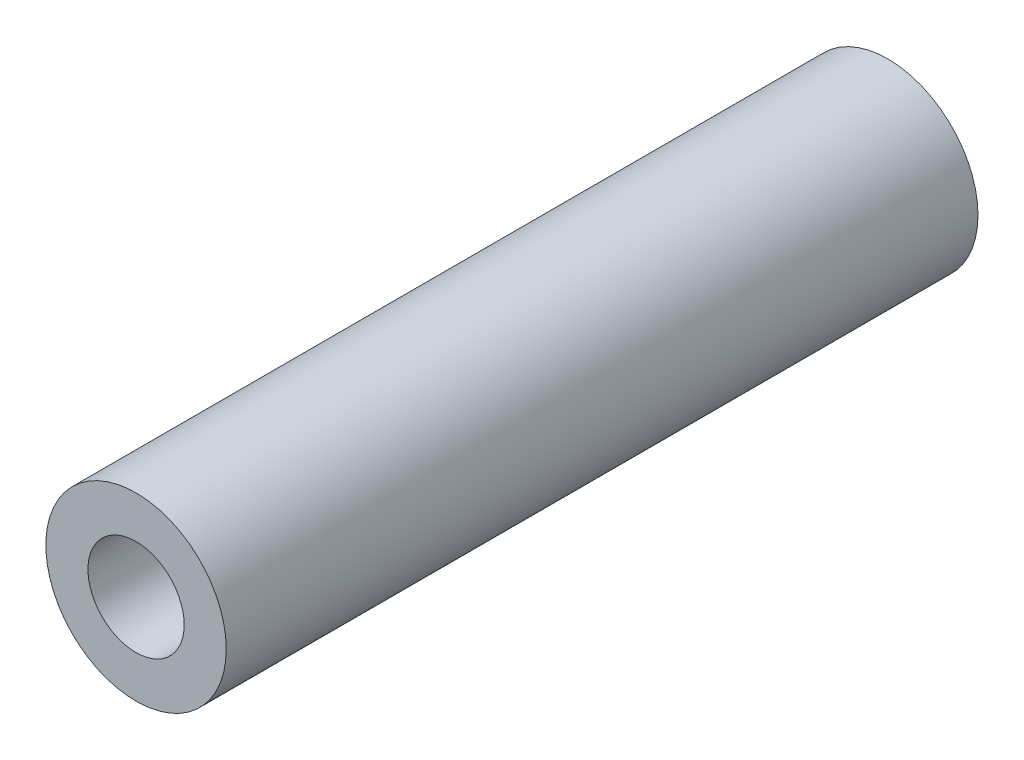
ISO-10303-21;
HEADER;
FILE_DESCRIPTION(('STEP AP214'),'2;1');
FILE_NAME('part.step','',(''),(''),'','','');
FILE_SCHEMA(('AUTOMOTIVE_DESIGN { 1 0 10303 214 1 1 1 1 }'));
ENDSEC;
DATA;
#1=APPLICATION_CONTEXT('core data for automotive mechanical design processes');
#2=APPLICATION_PROTOCOL_DEFINITION('international standard','automotive_design',2000,#1);
#3=PRODUCT_CONTEXT('',#1,'mechanical');
#4=PRODUCT('Part','Part','',(#3));
#5=PRODUCT_RELATED_PRODUCT_CATEGORY('part','',(#4));
#6=PRODUCT_DEFINITION_FORMATION('','',#4);
#7=PRODUCT_DEFINITION_CONTEXT('part definition',#1,'design');
#8=PRODUCT_DEFINITION('design','',#6,#7);
#9=PRODUCT_DEFINITION_SHAPE('','',#8);
#10=(LENGTH_UNIT() NAMED_UNIT(*) SI_UNIT(.MILLI.,.METRE.));
#11=(NAMED_UNIT(*) PLANE_ANGLE_UNIT() SI_UNIT($,.RADIAN.));
#12=(NAMED_UNIT(*) SI_UNIT($,.STERADIAN.) SOLID_ANGLE_UNIT());
#13=UNCERTAINTY_MEASURE_WITH_UNIT(LENGTH_MEASURE(1.E-05),#10,'distance_accuracy_value','');
#14=(GEOMETRIC_REPRESENTATION_CONTEXT(3) GLOBAL_UNCERTAINTY_ASSIGNED_CONTEXT((#13)) GLOBAL_UNIT_ASSIGNED_CONTEXT((#10,
#11,#12)) REPRESENTATION_CONTEXT('',''));
#15=CARTESIAN_POINT('',(0.,0.,0.));
#16=DIRECTION('',(0.,0.,1.));
#17=DIRECTION('',(1.,0.,0.));
#18=AXIS2_PLACEMENT_3D('',#15,#16,#17);
#19=CARTESIAN_POINT('',(0.,0.,25.));
#20=DIRECTION('',(0.,0.,1.));
#21=DIRECTION('',(1.,0.,0.));
#22=AXIS2_PLACEMENT_3D('',#19,#20,#21);
#23=PLANE('',#22);
#24=CARTESIAN_POINT('',(0.,0.,25.));
#25=DIRECTION('',(0.,0.,1.));
#26=DIRECTION('',(1.,0.,0.));
#27=AXIS2_PLACEMENT_3D('',#24,#25,#26);
#28=CIRCLE('',#27,3.);
#29=CARTESIAN_POINT('',(3.,0.,25.));
#30=VERTEX_POINT('',#29);
#31=EDGE_CURVE('E10',#30,#30,#28,.T.);
#32=ORIENTED_EDGE('',*,*,#31,.T.);
#33=EDGE_LOOP('',(#32));
#34=FACE_BOUND('',#33,.T.);
#35=CARTESIAN_POINT('',(0.,0.,25.));
#36=DIRECTION('',(0.,0.,1.));
#37=DIRECTION('',(1.,0.,0.));
#38=AXIS2_PLACEMENT_3D('',#35,#36,#37);
#39=CIRCLE('',#38,1.6);
#40=CARTESIAN_POINT('',(1.6,0.,25.));
#41=VERTEX_POINT('',#40);
#42=EDGE_CURVE('E45',#41,#41,#39,.T.);
#43=ORIENTED_EDGE('',*,*,#42,.F.);
#44=EDGE_LOOP('',(#43));
#45=FACE_BOUND('',#44,.T.);
#46=ADVANCED_FACE('F34',(#34,#45),#23,.T.);
#47=CARTESIAN_POINT('',(0.,0.,0.));
#48=DIRECTION('',(0.,0.,1.));
#49=DIRECTION('',(1.,0.,0.));
#50=AXIS2_PLACEMENT_3D('',#47,#48,#49);
#51=PLANE('',#50);
#52=CARTESIAN_POINT('',(0.,0.,0.));
#53=DIRECTION('',(0.,0.,1.));
#54=DIRECTION('',(1.,0.,0.));
#55=AXIS2_PLACEMENT_3D('',#52,#53,#54);
#56=CIRCLE('',#55,3.);
#57=CARTESIAN_POINT('',(3.,0.,0.));
#58=VERTEX_POINT('',#57);
#59=EDGE_CURVE('E38',#58,#58,#56,.T.);
#60=ORIENTED_EDGE('',*,*,#59,.F.);
#61=EDGE_LOOP('',(#60));
#62=FACE_BOUND('',#61,.T.);
#63=CARTESIAN_POINT('',(0.,0.,0.));
#64=DIRECTION('',(0.,0.,1.));
#65=DIRECTION('',(1.,0.,0.));
#66=AXIS2_PLACEMENT_3D('',#63,#64,#65);
#67=CIRCLE('',#66,1.6);
#68=CARTESIAN_POINT('',(1.6,0.,0.));
#69=VERTEX_POINT('',#68);
#70=EDGE_CURVE('E47',#69,#69,#67,.T.);
#71=ORIENTED_EDGE('',*,*,#70,.T.);
#72=EDGE_LOOP('',(#71));
#73=FACE_BOUND('',#72,.T.);
#74=ADVANCED_FACE('F57',(#62,#73),#51,.F.);
#75=CARTESIAN_POINT('',(0.,0.,25.));
#76=DIRECTION('',(0.,0.,-1.));
#77=DIRECTION('',(-1.,0.,0.));
#78=AXIS2_PLACEMENT_3D('',#75,#76,#77);
#79=CYLINDRICAL_SURFACE('',#78,3.);
#80=ORIENTED_EDGE('',*,*,#31,.F.);
#81=EDGE_LOOP('',(#80));
#82=FACE_BOUND('',#81,.T.);
#83=ORIENTED_EDGE('',*,*,#59,.T.);
#84=EDGE_LOOP('',(#83));
#85=FACE_BOUND('',#84,.T.);
#86=ADVANCED_FACE('F36',(#82,#85),#79,.T.);
#87=CARTESIAN_POINT('',(0.,0.,25.));
#88=DIRECTION('',(0.,0.,-1.));
#89=DIRECTION('',(-1.,0.,0.));
#90=AXIS2_PLACEMENT_3D('',#87,#88,#89);
#91=CYLINDRICAL_SURFACE('',#90,1.6);
#92=ORIENTED_EDGE('',*,*,#42,.T.);
#93=EDGE_LOOP('',(#92));
#94=FACE_BOUND('',#93,.T.);
#95=ORIENTED_EDGE('',*,*,#70,.F.);
#96=EDGE_LOOP('',(#95));
#97=FACE_BOUND('',#96,.T.);
#98=ADVANCED_FACE('F53',(#94,#97),#91,.F.);
#99=CLOSED_SHELL('',(#46,#74,#86,#98));
#100=MANIFOLD_SOLID_BREP('B2',#99);
#101=ADVANCED_BREP_SHAPE_REPRESENTATION('',(#18,#100),#14);
#102=SHAPE_DEFINITION_REPRESENTATION(#9,#101);
ENDSEC;
END-ISO-10303-21;
